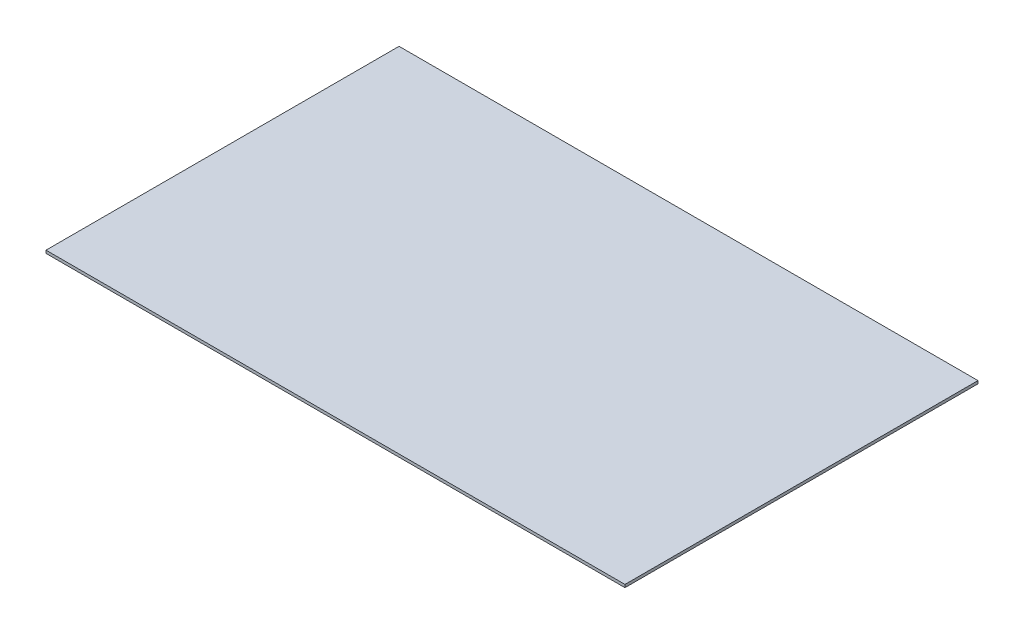
ISO-10303-21;
HEADER;
FILE_DESCRIPTION(('STEP AP214'),'2;1');
FILE_NAME('part.step','',(''),(''),'','','');
FILE_SCHEMA(('AUTOMOTIVE_DESIGN { 1 0 10303 214 1 1 1 1 }'));
ENDSEC;
DATA;
#1=APPLICATION_CONTEXT('core data for automotive mechanical design processes');
#2=APPLICATION_PROTOCOL_DEFINITION('international standard','automotive_design',2000,#1);
#3=PRODUCT_CONTEXT('',#1,'mechanical');
#4=PRODUCT('Part','Part','',(#3));
#5=PRODUCT_RELATED_PRODUCT_CATEGORY('part','',(#4));
#6=PRODUCT_DEFINITION_FORMATION('','',#4);
#7=PRODUCT_DEFINITION_CONTEXT('part definition',#1,'design');
#8=PRODUCT_DEFINITION('design','',#6,#7);
#9=PRODUCT_DEFINITION_SHAPE('','',#8);
#10=(LENGTH_UNIT() NAMED_UNIT(*) SI_UNIT(.MILLI.,.METRE.));
#11=(NAMED_UNIT(*) PLANE_ANGLE_UNIT() SI_UNIT($,.RADIAN.));
#12=(NAMED_UNIT(*) SI_UNIT($,.STERADIAN.) SOLID_ANGLE_UNIT());
#13=UNCERTAINTY_MEASURE_WITH_UNIT(LENGTH_MEASURE(1.E-05),#10,'distance_accuracy_value','');
#14=(GEOMETRIC_REPRESENTATION_CONTEXT(3) GLOBAL_UNCERTAINTY_ASSIGNED_CONTEXT((#13)) GLOBAL_UNIT_ASSIGNED_CONTEXT((#10,
#11,#12)) REPRESENTATION_CONTEXT('',''));
#15=CARTESIAN_POINT('',(0.,0.,0.));
#16=DIRECTION('',(0.,0.,1.));
#17=DIRECTION('',(1.,0.,0.));
#18=AXIS2_PLACEMENT_3D('',#15,#16,#17);
#19=CARTESIAN_POINT('',(255.,1.25,155.5));
#20=DIRECTION('',(-1.,0.,0.));
#21=DIRECTION('',(0.,0.,1.));
#22=AXIS2_PLACEMENT_3D('',#19,#20,#21);
#23=PLANE('',#22);
#24=DIRECTION('',(0.,0.,-1.));
#25=VECTOR('',#24,1.);
#26=CARTESIAN_POINT('',(255.,-1.25,155.5));
#27=LINE('',#26,#25);
#28=CARTESIAN_POINT('',(255.,-1.25,155.5));
#29=VERTEX_POINT('',#28);
#30=CARTESIAN_POINT('',(255.,-1.25,-155.5));
#31=VERTEX_POINT('',#30);
#32=EDGE_CURVE('E109',#29,#31,#27,.T.);
#33=ORIENTED_EDGE('',*,*,#32,.T.);
#34=DIRECTION('',(0.,-1.,0.));
#35=VECTOR('',#34,1.);
#36=CARTESIAN_POINT('',(255.,1.25,-155.5));
#37=LINE('',#36,#35);
#38=CARTESIAN_POINT('',(255.,1.25,-155.5));
#39=VERTEX_POINT('',#38);
#40=EDGE_CURVE('E11',#39,#31,#37,.T.);
#41=ORIENTED_EDGE('',*,*,#40,.F.);
#42=DIRECTION('',(0.,0.,-1.));
#43=VECTOR('',#42,1.);
#44=CARTESIAN_POINT('',(255.,1.25,155.5));
#45=LINE('',#44,#43);
#46=CARTESIAN_POINT('',(255.,1.25,155.5));
#47=VERTEX_POINT('',#46);
#48=EDGE_CURVE('E93',#47,#39,#45,.T.);
#49=ORIENTED_EDGE('',*,*,#48,.F.);
#50=DIRECTION('',(0.,-1.,0.));
#51=VECTOR('',#50,1.);
#52=CARTESIAN_POINT('',(255.,1.25,155.5));
#53=LINE('',#52,#51);
#54=EDGE_CURVE('E105',#47,#29,#53,.T.);
#55=ORIENTED_EDGE('',*,*,#54,.T.);
#56=EDGE_LOOP('',(#33,#41,#49,#55));
#57=FACE_BOUND('',#56,.T.);
#58=ADVANCED_FACE('F41',(#57),#23,.F.);
#59=CARTESIAN_POINT('',(-255.,1.25,-155.5));
#60=DIRECTION('',(0.,0.,1.));
#61=DIRECTION('',(1.,0.,0.));
#62=AXIS2_PLACEMENT_3D('',#59,#60,#61);
#63=PLANE('',#62);
#64=DIRECTION('',(-1.,0.,0.));
#65=VECTOR('',#64,1.);
#66=CARTESIAN_POINT('',(-255.,-1.25,-155.5));
#67=LINE('',#66,#65);
#68=CARTESIAN_POINT('',(-255.,-1.25,-155.5));
#69=VERTEX_POINT('',#68);
#70=EDGE_CURVE('E98',#31,#69,#67,.T.);
#71=ORIENTED_EDGE('',*,*,#70,.T.);
#72=DIRECTION('',(0.,-1.,0.));
#73=VECTOR('',#72,1.);
#74=CARTESIAN_POINT('',(-255.,1.25,-155.5));
#75=LINE('',#74,#73);
#76=CARTESIAN_POINT('',(-255.,1.25,-155.5));
#77=VERTEX_POINT('',#76);
#78=EDGE_CURVE('E50',#77,#69,#75,.T.);
#79=ORIENTED_EDGE('',*,*,#78,.F.);
#80=DIRECTION('',(-1.,0.,0.));
#81=VECTOR('',#80,1.);
#82=CARTESIAN_POINT('',(-255.,1.25,-155.5));
#83=LINE('',#82,#81);
#84=EDGE_CURVE('E88',#39,#77,#83,.T.);
#85=ORIENTED_EDGE('',*,*,#84,.F.);
#86=ORIENTED_EDGE('',*,*,#40,.T.);
#87=EDGE_LOOP('',(#71,#79,#85,#86));
#88=FACE_BOUND('',#87,.T.);
#89=ADVANCED_FACE('F97',(#88),#63,.F.);
#90=CARTESIAN_POINT('',(-255.,1.25,155.5));
#91=DIRECTION('',(1.,0.,0.));
#92=DIRECTION('',(0.,0.,-1.));
#93=AXIS2_PLACEMENT_3D('',#90,#91,#92);
#94=PLANE('',#93);
#95=DIRECTION('',(0.,0.,1.));
#96=VECTOR('',#95,1.);
#97=CARTESIAN_POINT('',(-255.,-1.25,155.5));
#98=LINE('',#97,#96);
#99=CARTESIAN_POINT('',(-255.,-1.25,155.5));
#100=VERTEX_POINT('',#99);
#101=EDGE_CURVE('E75',#69,#100,#98,.T.);
#102=ORIENTED_EDGE('',*,*,#101,.T.);
#103=DIRECTION('',(0.,-1.,0.));
#104=VECTOR('',#103,1.);
#105=CARTESIAN_POINT('',(-255.,1.25,155.5));
#106=LINE('',#105,#104);
#107=CARTESIAN_POINT('',(-255.,1.25,155.5));
#108=VERTEX_POINT('',#107);
#109=EDGE_CURVE('E100',#108,#100,#106,.T.);
#110=ORIENTED_EDGE('',*,*,#109,.F.);
#111=DIRECTION('',(0.,0.,1.));
#112=VECTOR('',#111,1.);
#113=CARTESIAN_POINT('',(-255.,1.25,155.5));
#114=LINE('',#113,#112);
#115=EDGE_CURVE('E91',#77,#108,#114,.T.);
#116=ORIENTED_EDGE('',*,*,#115,.F.);
#117=ORIENTED_EDGE('',*,*,#78,.T.);
#118=EDGE_LOOP('',(#102,#110,#116,#117));
#119=FACE_BOUND('',#118,.T.);
#120=ADVANCED_FACE('F101',(#119),#94,.F.);
#121=CARTESIAN_POINT('',(-255.,1.25,155.5));
#122=DIRECTION('',(0.,0.,-1.));
#123=DIRECTION('',(-1.,0.,0.));
#124=AXIS2_PLACEMENT_3D('',#121,#122,#123);
#125=PLANE('',#124);
#126=DIRECTION('',(1.,0.,0.));
#127=VECTOR('',#126,1.);
#128=CARTESIAN_POINT('',(-255.,-1.25,155.5));
#129=LINE('',#128,#127);
#130=EDGE_CURVE('E81',#100,#29,#129,.T.);
#131=ORIENTED_EDGE('',*,*,#130,.T.);
#132=ORIENTED_EDGE('',*,*,#54,.F.);
#133=DIRECTION('',(1.,0.,0.));
#134=VECTOR('',#133,1.);
#135=CARTESIAN_POINT('',(-255.,1.25,155.5));
#136=LINE('',#135,#134);
#137=EDGE_CURVE('E58',#108,#47,#136,.T.);
#138=ORIENTED_EDGE('',*,*,#137,.F.);
#139=ORIENTED_EDGE('',*,*,#109,.T.);
#140=EDGE_LOOP('',(#131,#132,#138,#139));
#141=FACE_BOUND('',#140,.T.);
#142=ADVANCED_FACE('F122',(#141),#125,.F.);
#143=CARTESIAN_POINT('',(0.,1.25,0.));
#144=DIRECTION('',(0.,-1.,0.));
#145=DIRECTION('',(0.,0.,-1.));
#146=AXIS2_PLACEMENT_3D('',#143,#144,#145);
#147=PLANE('',#146);
#148=ORIENTED_EDGE('',*,*,#48,.T.);
#149=ORIENTED_EDGE('',*,*,#84,.T.);
#150=ORIENTED_EDGE('',*,*,#115,.T.);
#151=ORIENTED_EDGE('',*,*,#137,.T.);
#152=EDGE_LOOP('',(#148,#149,#150,#151));
#153=FACE_BOUND('',#152,.T.);
#154=ADVANCED_FACE('F89',(#153),#147,.F.);
#155=CARTESIAN_POINT('',(0.,-1.25,0.));
#156=DIRECTION('',(0.,-1.,0.));
#157=DIRECTION('',(0.,0.,-1.));
#158=AXIS2_PLACEMENT_3D('',#155,#156,#157);
#159=PLANE('',#158);
#160=ORIENTED_EDGE('',*,*,#32,.F.);
#161=ORIENTED_EDGE('',*,*,#130,.F.);
#162=ORIENTED_EDGE('',*,*,#101,.F.);
#163=ORIENTED_EDGE('',*,*,#70,.F.);
#164=EDGE_LOOP('',(#160,#161,#162,#163));
#165=FACE_BOUND('',#164,.T.);
#166=ADVANCED_FACE('F125',(#165),#159,.T.);
#167=CLOSED_SHELL('',(#58,#89,#120,#142,#154,#166));
#168=MANIFOLD_SOLID_BREP('B2',#167);
#169=ADVANCED_BREP_SHAPE_REPRESENTATION('',(#18,#168),#14);
#170=SHAPE_DEFINITION_REPRESENTATION(#9,#169);
ENDSEC;
END-ISO-10303-21;
